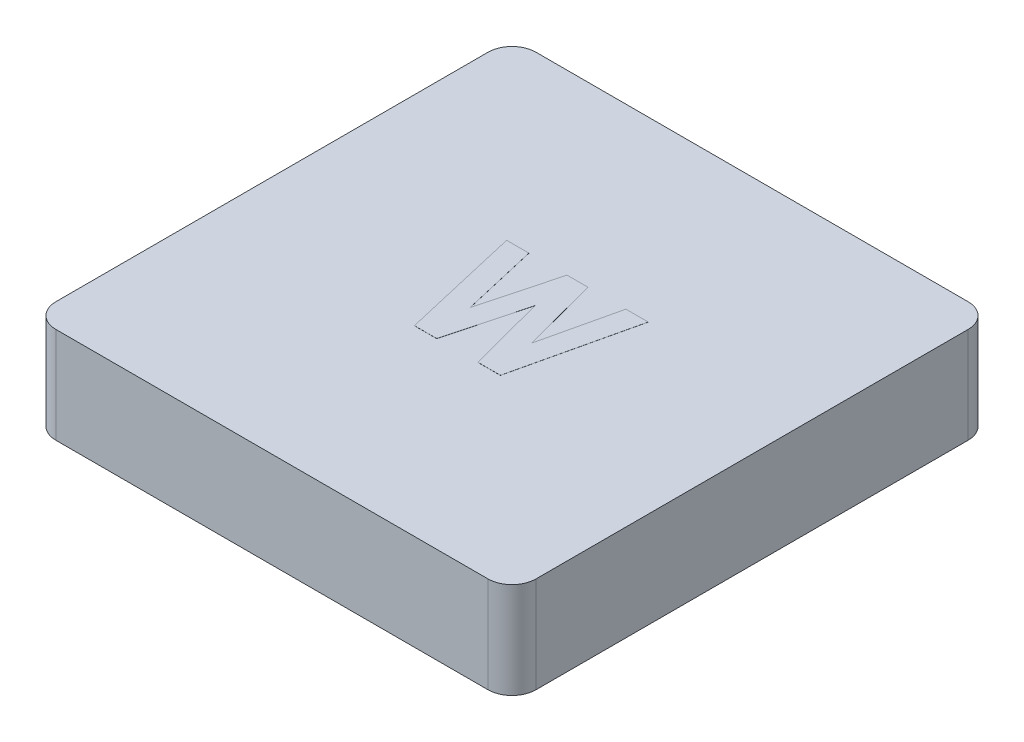
ISO-10303-21;
HEADER;
FILE_DESCRIPTION(('STEP AP214'),'2;1');
FILE_NAME('part.step','',(''),(''),'','','');
FILE_SCHEMA(('AUTOMOTIVE_DESIGN { 1 0 10303 214 1 1 1 1 }'));
ENDSEC;
DATA;
#1=APPLICATION_CONTEXT('core data for automotive mechanical design processes');
#2=APPLICATION_PROTOCOL_DEFINITION('international standard','automotive_design',2000,#1);
#3=PRODUCT_CONTEXT('',#1,'mechanical');
#4=PRODUCT('Part','Part','',(#3));
#5=PRODUCT_RELATED_PRODUCT_CATEGORY('part','',(#4));
#6=PRODUCT_DEFINITION_FORMATION('','',#4);
#7=PRODUCT_DEFINITION_CONTEXT('part definition',#1,'design');
#8=PRODUCT_DEFINITION('design','',#6,#7);
#9=PRODUCT_DEFINITION_SHAPE('','',#8);
#10=(LENGTH_UNIT() NAMED_UNIT(*) SI_UNIT(.MILLI.,.METRE.));
#11=(NAMED_UNIT(*) PLANE_ANGLE_UNIT() SI_UNIT($,.RADIAN.));
#12=(NAMED_UNIT(*) SI_UNIT($,.STERADIAN.) SOLID_ANGLE_UNIT());
#13=UNCERTAINTY_MEASURE_WITH_UNIT(LENGTH_MEASURE(1.E-05),#10,'distance_accuracy_value','');
#14=(GEOMETRIC_REPRESENTATION_CONTEXT(3) GLOBAL_UNCERTAINTY_ASSIGNED_CONTEXT((#13)) GLOBAL_UNIT_ASSIGNED_CONTEXT((#10,
#11,#12)) REPRESENTATION_CONTEXT('',''));
#15=CARTESIAN_POINT('',(0.,0.,0.));
#16=DIRECTION('',(0.,0.,1.));
#17=DIRECTION('',(1.,0.,0.));
#18=AXIS2_PLACEMENT_3D('',#15,#16,#17);
#19=CARTESIAN_POINT('',(0.,2.54,-12.7));
#20=DIRECTION('',(1.,0.,0.));
#21=DIRECTION('',(0.,0.,-1.));
#22=AXIS2_PLACEMENT_3D('',#19,#20,#21);
#23=PLANE('',#22);
#24=DIRECTION('',(0.,0.,1.));
#25=VECTOR('',#24,1.);
#26=CARTESIAN_POINT('',(0.,2.54,-12.7));
#27=LINE('',#26,#25);
#28=CARTESIAN_POINT('',(0.,2.54,-12.065));
#29=VERTEX_POINT('',#28);
#30=CARTESIAN_POINT('',(0.,2.54,-0.635));
#31=VERTEX_POINT('',#30);
#32=EDGE_CURVE('E350',#29,#31,#27,.T.);
#33=ORIENTED_EDGE('',*,*,#32,.F.);
#34=DIRECTION('',(0.,-1.,0.));
#35=VECTOR('',#34,1.);
#36=CARTESIAN_POINT('',(0.,2.54,-12.065));
#37=LINE('',#36,#35);
#38=CARTESIAN_POINT('',(0.,0.,-12.065));
#39=VERTEX_POINT('',#38);
#40=EDGE_CURVE('E375',#29,#39,#37,.T.);
#41=ORIENTED_EDGE('',*,*,#40,.T.);
#42=DIRECTION('',(0.,0.,1.));
#43=VECTOR('',#42,1.);
#44=CARTESIAN_POINT('',(0.,0.,-12.7));
#45=LINE('',#44,#43);
#46=CARTESIAN_POINT('',(0.,0.,-0.635));
#47=VERTEX_POINT('',#46);
#48=EDGE_CURVE('E330',#39,#47,#45,.T.);
#49=ORIENTED_EDGE('',*,*,#48,.T.);
#50=DIRECTION('',(0.,-1.,0.));
#51=VECTOR('',#50,1.);
#52=CARTESIAN_POINT('',(0.,2.54,-0.635));
#53=LINE('',#52,#51);
#54=EDGE_CURVE('E363',#47,#31,#53,.F.);
#55=ORIENTED_EDGE('',*,*,#54,.T.);
#56=EDGE_LOOP('',(#33,#41,#49,#55));
#57=FACE_BOUND('',#56,.T.);
#58=ADVANCED_FACE('F33',(#57),#23,.F.);
#59=CARTESIAN_POINT('',(0.,2.54,0.));
#60=DIRECTION('',(0.,0.,-1.));
#61=DIRECTION('',(-1.,0.,0.));
#62=AXIS2_PLACEMENT_3D('',#59,#60,#61);
#63=PLANE('',#62);
#64=DIRECTION('',(1.,0.,0.));
#65=VECTOR('',#64,1.);
#66=CARTESIAN_POINT('',(0.,0.,0.));
#67=LINE('',#66,#65);
#68=CARTESIAN_POINT('',(0.635,0.,0.));
#69=VERTEX_POINT('',#68);
#70=CARTESIAN_POINT('',(12.065,0.,0.));
#71=VERTEX_POINT('',#70);
#72=EDGE_CURVE('E366',#69,#71,#67,.T.);
#73=ORIENTED_EDGE('',*,*,#72,.T.);
#74=DIRECTION('',(0.,-1.,0.));
#75=VECTOR('',#74,1.);
#76=CARTESIAN_POINT('',(12.065,2.54,0.));
#77=LINE('',#76,#75);
#78=CARTESIAN_POINT('',(12.065,2.54,0.));
#79=VERTEX_POINT('',#78);
#80=EDGE_CURVE('E41',#71,#79,#77,.F.);
#81=ORIENTED_EDGE('',*,*,#80,.T.);
#82=DIRECTION('',(1.,0.,0.));
#83=VECTOR('',#82,1.);
#84=CARTESIAN_POINT('',(0.,2.54,0.));
#85=LINE('',#84,#83);
#86=CARTESIAN_POINT('',(0.635,2.54,0.));
#87=VERTEX_POINT('',#86);
#88=EDGE_CURVE('E353',#87,#79,#85,.T.);
#89=ORIENTED_EDGE('',*,*,#88,.F.);
#90=DIRECTION('',(0.,-1.,0.));
#91=VECTOR('',#90,1.);
#92=CARTESIAN_POINT('',(0.635,2.54,0.));
#93=LINE('',#92,#91);
#94=EDGE_CURVE('E404',#87,#69,#93,.T.);
#95=ORIENTED_EDGE('',*,*,#94,.T.);
#96=EDGE_LOOP('',(#73,#81,#89,#95));
#97=FACE_BOUND('',#96,.T.);
#98=ADVANCED_FACE('F409',(#97),#63,.F.);
#99=CARTESIAN_POINT('',(12.7,2.54,0.));
#100=DIRECTION('',(-1.,0.,0.));
#101=DIRECTION('',(0.,0.,1.));
#102=AXIS2_PLACEMENT_3D('',#99,#100,#101);
#103=PLANE('',#102);
#104=DIRECTION('',(0.,0.,-1.));
#105=VECTOR('',#104,1.);
#106=CARTESIAN_POINT('',(12.7,0.,0.));
#107=LINE('',#106,#105);
#108=CARTESIAN_POINT('',(12.7,0.,-0.635));
#109=VERTEX_POINT('',#108);
#110=CARTESIAN_POINT('',(12.7,0.,-12.065));
#111=VERTEX_POINT('',#110);
#112=EDGE_CURVE('E369',#109,#111,#107,.T.);
#113=ORIENTED_EDGE('',*,*,#112,.T.);
#114=DIRECTION('',(0.,-1.,0.));
#115=VECTOR('',#114,1.);
#116=CARTESIAN_POINT('',(12.7,2.54,-12.065));
#117=LINE('',#116,#115);
#118=CARTESIAN_POINT('',(12.7,2.54,-12.065));
#119=VERTEX_POINT('',#118);
#120=EDGE_CURVE('E402',#111,#119,#117,.F.);
#121=ORIENTED_EDGE('',*,*,#120,.T.);
#122=DIRECTION('',(0.,0.,-1.));
#123=VECTOR('',#122,1.);
#124=CARTESIAN_POINT('',(12.7,2.54,0.));
#125=LINE('',#124,#123);
#126=CARTESIAN_POINT('',(12.7,2.54,-0.635));
#127=VERTEX_POINT('',#126);
#128=EDGE_CURVE('E357',#127,#119,#125,.T.);
#129=ORIENTED_EDGE('',*,*,#128,.F.);
#130=DIRECTION('',(0.,-1.,0.));
#131=VECTOR('',#130,1.);
#132=CARTESIAN_POINT('',(12.7,2.54,-0.635));
#133=LINE('',#132,#131);
#134=EDGE_CURVE('E399',#127,#109,#133,.T.);
#135=ORIENTED_EDGE('',*,*,#134,.T.);
#136=EDGE_LOOP('',(#113,#121,#129,#135));
#137=FACE_BOUND('',#136,.T.);
#138=ADVANCED_FACE('F422',(#137),#103,.F.);
#139=CARTESIAN_POINT('',(12.7,2.54,-12.7));
#140=DIRECTION('',(0.,0.,1.));
#141=DIRECTION('',(1.,0.,0.));
#142=AXIS2_PLACEMENT_3D('',#139,#140,#141);
#143=PLANE('',#142);
#144=DIRECTION('',(-1.,0.,0.));
#145=VECTOR('',#144,1.);
#146=CARTESIAN_POINT('',(12.7,0.,-12.7));
#147=LINE('',#146,#145);
#148=CARTESIAN_POINT('',(12.065,0.,-12.7));
#149=VERTEX_POINT('',#148);
#150=CARTESIAN_POINT('',(0.634999999999995,0.,-12.7));
#151=VERTEX_POINT('',#150);
#152=EDGE_CURVE('E354',#149,#151,#147,.T.);
#153=ORIENTED_EDGE('',*,*,#152,.T.);
#154=DIRECTION('',(0.,-1.,0.));
#155=VECTOR('',#154,1.);
#156=CARTESIAN_POINT('',(0.634999999999995,2.54,-12.7));
#157=LINE('',#156,#155);
#158=CARTESIAN_POINT('',(0.634999999999995,2.54,-12.7));
#159=VERTEX_POINT('',#158);
#160=EDGE_CURVE('E389',#151,#159,#157,.F.);
#161=ORIENTED_EDGE('',*,*,#160,.T.);
#162=DIRECTION('',(-1.,0.,0.));
#163=VECTOR('',#162,1.);
#164=CARTESIAN_POINT('',(12.7,2.54,-12.7));
#165=LINE('',#164,#163);
#166=CARTESIAN_POINT('',(12.065,2.54,-12.7));
#167=VERTEX_POINT('',#166);
#168=EDGE_CURVE('E360',#167,#159,#165,.T.);
#169=ORIENTED_EDGE('',*,*,#168,.F.);
#170=DIRECTION('',(0.,-1.,0.));
#171=VECTOR('',#170,1.);
#172=CARTESIAN_POINT('',(12.065,2.54,-12.7));
#173=LINE('',#172,#171);
#174=EDGE_CURVE('E386',#167,#149,#173,.T.);
#175=ORIENTED_EDGE('',*,*,#174,.T.);
#176=EDGE_LOOP('',(#153,#161,#169,#175));
#177=FACE_BOUND('',#176,.T.);
#178=ADVANCED_FACE('F434',(#177),#143,.F.);
#179=CARTESIAN_POINT('',(0.,2.54,0.));
#180=DIRECTION('',(0.,1.,0.));
#181=DIRECTION('',(0.,0.,1.));
#182=AXIS2_PLACEMENT_3D('',#179,#180,#181);
#183=PLANE('',#182);
#184=DIRECTION('',(-0.225785808146435,0.,-0.974176969980127));
#185=VECTOR('',#184,1.);
#186=CARTESIAN_POINT('',(5.29273008814102,2.54,-4.826));
#187=LINE('',#186,#185);
#188=CARTESIAN_POINT('',(5.29273008814102,2.54,-4.826));
#189=VERTEX_POINT('',#188);
#190=CARTESIAN_POINT('',(4.55685769230769,2.54,-8.001));
#191=VERTEX_POINT('',#190);
#192=EDGE_CURVE('E257',#189,#191,#187,.T.);
#193=ORIENTED_EDGE('',*,*,#192,.T.);
#194=DIRECTION('',(1.,0.,0.));
#195=VECTOR('',#194,1.);
#196=CARTESIAN_POINT('',(4.55685769230769,2.54,-8.001));
#197=LINE('',#196,#195);
#198=CARTESIAN_POINT('',(5.14517399839743,2.54,-8.001));
#199=VERTEX_POINT('',#198);
#200=EDGE_CURVE('E205',#191,#199,#197,.T.);
#201=ORIENTED_EDGE('',*,*,#200,.T.);
#202=DIRECTION('',(0.225886278135308,0.,0.974153678507749));
#203=VECTOR('',#202,1.);
#204=CARTESIAN_POINT('',(5.14517399839743,2.54,-8.001));
#205=LINE('',#204,#203);
#206=CARTESIAN_POINT('',(5.61519102564102,2.54,-5.97401181891026));
#207=VERTEX_POINT('',#206);
#208=EDGE_CURVE('E260',#199,#207,#205,.T.);
#209=ORIENTED_EDGE('',*,*,#208,.T.);
#210=DIRECTION('',(0.256850962616634,0.,-0.966451024627171));
#211=VECTOR('',#210,1.);
#212=CARTESIAN_POINT('',(5.61519102564102,2.54,-5.97401181891026));
#213=LINE('',#212,#211);
#214=CARTESIAN_POINT('',(6.15389795673076,2.54,-8.001));
#215=VERTEX_POINT('',#214);
#216=EDGE_CURVE('E262',#207,#215,#213,.T.);
#217=ORIENTED_EDGE('',*,*,#216,.T.);
#218=DIRECTION('',(1.,0.,0.));
#219=VECTOR('',#218,1.);
#220=CARTESIAN_POINT('',(6.15389795673076,2.54,-8.001));
#221=LINE('',#220,#219);
#222=CARTESIAN_POINT('',(6.70786931089743,2.54,-8.001));
#223=VERTEX_POINT('',#222);
#224=EDGE_CURVE('E264',#215,#223,#221,.T.);
#225=ORIENTED_EDGE('',*,*,#224,.T.);
#226=DIRECTION('',(0.255433926933029,0.,0.966826514412783));
#227=VECTOR('',#226,1.);
#228=CARTESIAN_POINT('',(6.70786931089743,2.54,-8.001));
#229=LINE('',#228,#227);
#230=CARTESIAN_POINT('',(7.24339615384615,2.54,-5.97401181891026));
#231=VERTEX_POINT('',#230);
#232=EDGE_CURVE('E266',#223,#231,#229,.T.);
#233=ORIENTED_EDGE('',*,*,#232,.T.);
#234=DIRECTION('',(0.225306021326748,0.,-0.974288046090021));
#235=VECTOR('',#234,1.);
#236=CARTESIAN_POINT('',(7.24339615384615,2.54,-5.97401181891026));
#237=LINE('',#236,#235);
#238=CARTESIAN_POINT('',(7.71214114583333,2.54,-8.001));
#239=VERTEX_POINT('',#238);
#240=EDGE_CURVE('E268',#231,#239,#237,.T.);
#241=ORIENTED_EDGE('',*,*,#240,.T.);
#242=DIRECTION('',(1.,0.,0.));
#243=VECTOR('',#242,1.);
#244=CARTESIAN_POINT('',(7.71214114583333,2.54,-8.001));
#245=LINE('',#244,#243);
#246=CARTESIAN_POINT('',(8.30172948717948,2.54,-8.001));
#247=VERTEX_POINT('',#246);
#248=EDGE_CURVE('E270',#239,#247,#245,.T.);
#249=ORIENTED_EDGE('',*,*,#248,.T.);
#250=DIRECTION('',(-0.225415360898369,0.,0.974262754636067));
#251=VECTOR('',#250,1.);
#252=CARTESIAN_POINT('',(8.30172948717948,2.54,-8.001));
#253=LINE('',#252,#251);
#254=CARTESIAN_POINT('',(7.56712912660256,2.54,-4.826));
#255=VERTEX_POINT('',#254);
#256=EDGE_CURVE('E272',#247,#255,#253,.T.);
#257=ORIENTED_EDGE('',*,*,#256,.T.);
#258=DIRECTION('',(-1.,0.,0.));
#259=VECTOR('',#258,1.);
#260=CARTESIAN_POINT('',(7.56712912660256,2.54,-4.826));
#261=LINE('',#260,#259);
#262=CARTESIAN_POINT('',(6.97181662660256,2.54,-4.826));
#263=VERTEX_POINT('',#262);
#264=EDGE_CURVE('E274',#255,#263,#261,.T.);
#265=ORIENTED_EDGE('',*,*,#264,.T.);
#266=DIRECTION('',(-0.255554924607687,0.,-0.966794538932011));
#267=VECTOR('',#266,1.);
#268=CARTESIAN_POINT('',(6.97181662660256,2.54,-4.826));
#269=LINE('',#268,#267);
#270=CARTESIAN_POINT('',(6.42929358974358,2.54,-6.87842888621795));
#271=VERTEX_POINT('',#270);
#272=EDGE_CURVE('E276',#263,#271,#269,.T.);
#273=ORIENTED_EDGE('',*,*,#272,.T.);
#274=DIRECTION('',(-0.256954266459514,0.,0.96642356394505));
#275=VECTOR('',#274,1.);
#276=CARTESIAN_POINT('',(6.42929358974358,2.54,-6.87842888621795));
#277=LINE('',#276,#275);
#278=CARTESIAN_POINT('',(5.88359046474358,2.54,-4.826));
#279=VERTEX_POINT('',#278);
#280=EDGE_CURVE('E53',#271,#279,#277,.T.);
#281=ORIENTED_EDGE('',*,*,#280,.T.);
#282=DIRECTION('',(-1.,0.,0.));
#283=VECTOR('',#282,1.);
#284=CARTESIAN_POINT('',(5.88359046474358,2.54,-4.826));
#285=LINE('',#284,#283);
#286=EDGE_CURVE('E48',#279,#189,#285,.T.);
#287=ORIENTED_EDGE('',*,*,#286,.T.);
#288=EDGE_LOOP('',(#193,#201,#209,#217,#225,#233,#241,#249,#257,#265,#273,#281,#287));
#289=FACE_BOUND('',#288,.T.);
#290=ORIENTED_EDGE('',*,*,#168,.T.);
#291=CARTESIAN_POINT('',(0.634999999999995,2.54,-12.065));
#292=DIRECTION('',(0.,1.,0.));
#293=DIRECTION('',(0.,0.,1.));
#294=AXIS2_PLACEMENT_3D('',#291,#292,#293);
#295=CIRCLE('',#294,0.635);
#296=EDGE_CURVE('E397',#159,#29,#295,.T.);
#297=ORIENTED_EDGE('',*,*,#296,.T.);
#298=ORIENTED_EDGE('',*,*,#32,.T.);
#299=CARTESIAN_POINT('',(0.635,2.54,-0.635));
#300=DIRECTION('',(0.,1.,0.));
#301=DIRECTION('',(0.,0.,1.));
#302=AXIS2_PLACEMENT_3D('',#299,#300,#301);
#303=CIRCLE('',#302,0.635);
#304=EDGE_CURVE('E391',#31,#87,#303,.T.);
#305=ORIENTED_EDGE('',*,*,#304,.T.);
#306=ORIENTED_EDGE('',*,*,#88,.T.);
#307=CARTESIAN_POINT('',(12.065,2.54,-0.635));
#308=DIRECTION('',(0.,1.,0.));
#309=DIRECTION('',(0.,0.,1.));
#310=AXIS2_PLACEMENT_3D('',#307,#308,#309);
#311=CIRCLE('',#310,0.635);
#312=EDGE_CURVE('E393',#79,#127,#311,.T.);
#313=ORIENTED_EDGE('',*,*,#312,.T.);
#314=ORIENTED_EDGE('',*,*,#128,.T.);
#315=CARTESIAN_POINT('',(12.065,2.54,-12.065));
#316=DIRECTION('',(0.,1.,0.));
#317=DIRECTION('',(0.,0.,1.));
#318=AXIS2_PLACEMENT_3D('',#315,#316,#317);
#319=CIRCLE('',#318,0.635);
#320=EDGE_CURVE('E395',#119,#167,#319,.T.);
#321=ORIENTED_EDGE('',*,*,#320,.T.);
#322=EDGE_LOOP('',(#290,#297,#298,#305,#306,#313,#314,#321));
#323=FACE_BOUND('',#322,.T.);
#324=ADVANCED_FACE('F415',(#289,#323),#183,.T.);
#325=CARTESIAN_POINT('',(0.,0.,0.));
#326=DIRECTION('',(0.,1.,0.));
#327=DIRECTION('',(0.,0.,1.));
#328=AXIS2_PLACEMENT_3D('',#325,#326,#327);
#329=PLANE('',#328);
#330=DIRECTION('',(-1.,0.,0.));
#331=VECTOR('',#330,1.);
#332=CARTESIAN_POINT('',(12.7,0.,-12.065));
#333=LINE('',#332,#331);
#334=CARTESIAN_POINT('',(12.065,0.,-12.065));
#335=VERTEX_POINT('',#334);
#336=CARTESIAN_POINT('',(0.634999999999995,0.,-12.065));
#337=VERTEX_POINT('',#336);
#338=EDGE_CURVE('E318',#335,#337,#333,.T.);
#339=ORIENTED_EDGE('',*,*,#338,.T.);
#340=DIRECTION('',(0.,0.,1.));
#341=VECTOR('',#340,1.);
#342=CARTESIAN_POINT('',(0.634999999999995,0.,-12.7));
#343=LINE('',#342,#341);
#344=CARTESIAN_POINT('',(0.635,0.,-0.635));
#345=VERTEX_POINT('',#344);
#346=EDGE_CURVE('E313',#337,#345,#343,.T.);
#347=ORIENTED_EDGE('',*,*,#346,.T.);
#348=DIRECTION('',(1.,0.,0.));
#349=VECTOR('',#348,1.);
#350=CARTESIAN_POINT('',(0.,0.,-0.635));
#351=LINE('',#350,#349);
#352=CARTESIAN_POINT('',(12.065,0.,-0.635));
#353=VERTEX_POINT('',#352);
#354=EDGE_CURVE('E342',#345,#353,#351,.T.);
#355=ORIENTED_EDGE('',*,*,#354,.T.);
#356=DIRECTION('',(0.,0.,-1.));
#357=VECTOR('',#356,1.);
#358=CARTESIAN_POINT('',(12.065,0.,0.));
#359=LINE('',#358,#357);
#360=EDGE_CURVE('E345',#353,#335,#359,.T.);
#361=ORIENTED_EDGE('',*,*,#360,.T.);
#362=EDGE_LOOP('',(#339,#347,#355,#361));
#363=FACE_BOUND('',#362,.T.);
#364=ORIENTED_EDGE('',*,*,#48,.F.);
#365=CARTESIAN_POINT('',(0.634999999999995,0.,-12.065));
#366=DIRECTION('',(0.,1.,0.));
#367=DIRECTION('',(0.,0.,1.));
#368=AXIS2_PLACEMENT_3D('',#365,#366,#367);
#369=CIRCLE('',#368,0.635);
#370=EDGE_CURVE('E384',#39,#151,#369,.F.);
#371=ORIENTED_EDGE('',*,*,#370,.T.);
#372=ORIENTED_EDGE('',*,*,#152,.F.);
#373=CARTESIAN_POINT('',(12.065,0.,-12.065));
#374=DIRECTION('',(0.,1.,0.));
#375=DIRECTION('',(0.,0.,1.));
#376=AXIS2_PLACEMENT_3D('',#373,#374,#375);
#377=CIRCLE('',#376,0.635);
#378=EDGE_CURVE('E382',#149,#111,#377,.F.);
#379=ORIENTED_EDGE('',*,*,#378,.T.);
#380=ORIENTED_EDGE('',*,*,#112,.F.);
#381=CARTESIAN_POINT('',(12.065,0.,-0.635));
#382=DIRECTION('',(0.,1.,0.));
#383=DIRECTION('',(0.,0.,1.));
#384=AXIS2_PLACEMENT_3D('',#381,#382,#383);
#385=CIRCLE('',#384,0.635);
#386=EDGE_CURVE('E380',#109,#71,#385,.F.);
#387=ORIENTED_EDGE('',*,*,#386,.T.);
#388=ORIENTED_EDGE('',*,*,#72,.F.);
#389=CARTESIAN_POINT('',(0.635,0.,-0.635));
#390=DIRECTION('',(0.,1.,0.));
#391=DIRECTION('',(0.,0.,1.));
#392=AXIS2_PLACEMENT_3D('',#389,#390,#391);
#393=CIRCLE('',#392,0.635);
#394=EDGE_CURVE('E378',#69,#47,#393,.F.);
#395=ORIENTED_EDGE('',*,*,#394,.T.);
#396=EDGE_LOOP('',(#364,#371,#372,#379,#380,#387,#388,#395));
#397=FACE_BOUND('',#396,.T.);
#398=ADVANCED_FACE('F426',(#363,#397),#329,.F.);
#399=CARTESIAN_POINT('',(0.634999999999995,2.54,-12.065));
#400=DIRECTION('',(0.,-1.,0.));
#401=DIRECTION('',(0.,0.,-1.));
#402=AXIS2_PLACEMENT_3D('',#399,#400,#401);
#403=CYLINDRICAL_SURFACE('',#402,0.635);
#404=ORIENTED_EDGE('',*,*,#296,.F.);
#405=ORIENTED_EDGE('',*,*,#160,.F.);
#406=ORIENTED_EDGE('',*,*,#370,.F.);
#407=ORIENTED_EDGE('',*,*,#40,.F.);
#408=EDGE_LOOP('',(#404,#405,#406,#407));
#409=FACE_BOUND('',#408,.T.);
#410=ADVANCED_FACE('F440',(#409),#403,.T.);
#411=CARTESIAN_POINT('',(12.065,2.54,-12.065));
#412=DIRECTION('',(0.,-1.,0.));
#413=DIRECTION('',(0.,0.,-1.));
#414=AXIS2_PLACEMENT_3D('',#411,#412,#413);
#415=CYLINDRICAL_SURFACE('',#414,0.635);
#416=ORIENTED_EDGE('',*,*,#320,.F.);
#417=ORIENTED_EDGE('',*,*,#120,.F.);
#418=ORIENTED_EDGE('',*,*,#378,.F.);
#419=ORIENTED_EDGE('',*,*,#174,.F.);
#420=EDGE_LOOP('',(#416,#417,#418,#419));
#421=FACE_BOUND('',#420,.T.);
#422=ADVANCED_FACE('F431',(#421),#415,.T.);
#423=CARTESIAN_POINT('',(12.065,2.54,-0.635));
#424=DIRECTION('',(0.,-1.,0.));
#425=DIRECTION('',(0.,0.,-1.));
#426=AXIS2_PLACEMENT_3D('',#423,#424,#425);
#427=CYLINDRICAL_SURFACE('',#426,0.635);
#428=ORIENTED_EDGE('',*,*,#312,.F.);
#429=ORIENTED_EDGE('',*,*,#80,.F.);
#430=ORIENTED_EDGE('',*,*,#386,.F.);
#431=ORIENTED_EDGE('',*,*,#134,.F.);
#432=EDGE_LOOP('',(#428,#429,#430,#431));
#433=FACE_BOUND('',#432,.T.);
#434=ADVANCED_FACE('F419',(#433),#427,.T.);
#435=CARTESIAN_POINT('',(0.635,2.54,-0.635));
#436=DIRECTION('',(0.,-1.,0.));
#437=DIRECTION('',(0.,0.,-1.));
#438=AXIS2_PLACEMENT_3D('',#435,#436,#437);
#439=CYLINDRICAL_SURFACE('',#438,0.635);
#440=ORIENTED_EDGE('',*,*,#304,.F.);
#441=ORIENTED_EDGE('',*,*,#54,.F.);
#442=ORIENTED_EDGE('',*,*,#394,.F.);
#443=ORIENTED_EDGE('',*,*,#94,.F.);
#444=EDGE_LOOP('',(#440,#441,#442,#443));
#445=FACE_BOUND('',#444,.T.);
#446=ADVANCED_FACE('F35',(#445),#439,.T.);
#447=CARTESIAN_POINT('',(0.634999999999995,2.54,-12.7));
#448=DIRECTION('',(1.,0.,0.));
#449=DIRECTION('',(0.,0.,-1.));
#450=AXIS2_PLACEMENT_3D('',#447,#448,#449);
#451=PLANE('',#450);
#452=DIRECTION('',(0.,0.,1.));
#453=VECTOR('',#452,1.);
#454=CARTESIAN_POINT('',(0.634999999999995,1.905,-12.7));
#455=LINE('',#454,#453);
#456=CARTESIAN_POINT('',(0.634999999999995,1.905,-12.065));
#457=VERTEX_POINT('',#456);
#458=CARTESIAN_POINT('',(0.635,1.905,-0.635));
#459=VERTEX_POINT('',#458);
#460=EDGE_CURVE('E314',#457,#459,#455,.T.);
#461=ORIENTED_EDGE('',*,*,#460,.T.);
#462=DIRECTION('',(0.,1.,0.));
#463=VECTOR('',#462,1.);
#464=CARTESIAN_POINT('',(0.635,2.54,-0.635));
#465=LINE('',#464,#463);
#466=EDGE_CURVE('E323',#345,#459,#465,.T.);
#467=ORIENTED_EDGE('',*,*,#466,.F.);
#468=ORIENTED_EDGE('',*,*,#346,.F.);
#469=DIRECTION('',(0.,1.,0.));
#470=VECTOR('',#469,1.);
#471=CARTESIAN_POINT('',(0.634999999999995,2.54,-12.065));
#472=LINE('',#471,#470);
#473=EDGE_CURVE('E319',#337,#457,#472,.T.);
#474=ORIENTED_EDGE('',*,*,#473,.T.);
#475=EDGE_LOOP('',(#461,#467,#468,#474));
#476=FACE_BOUND('',#475,.T.);
#477=ADVANCED_FACE('F445',(#476),#451,.T.);
#478=CARTESIAN_POINT('',(0.,2.54,-0.635));
#479=DIRECTION('',(0.,0.,-1.));
#480=DIRECTION('',(-1.,0.,0.));
#481=AXIS2_PLACEMENT_3D('',#478,#479,#480);
#482=PLANE('',#481);
#483=ORIENTED_EDGE('',*,*,#354,.F.);
#484=ORIENTED_EDGE('',*,*,#466,.T.);
#485=DIRECTION('',(1.,0.,0.));
#486=VECTOR('',#485,1.);
#487=CARTESIAN_POINT('',(0.,1.905,-0.635));
#488=LINE('',#487,#486);
#489=CARTESIAN_POINT('',(12.065,1.905,-0.635));
#490=VERTEX_POINT('',#489);
#491=EDGE_CURVE('E317',#459,#490,#488,.T.);
#492=ORIENTED_EDGE('',*,*,#491,.T.);
#493=DIRECTION('',(0.,1.,0.));
#494=VECTOR('',#493,1.);
#495=CARTESIAN_POINT('',(12.065,2.54,-0.635));
#496=LINE('',#495,#494);
#497=EDGE_CURVE('E327',#353,#490,#496,.T.);
#498=ORIENTED_EDGE('',*,*,#497,.F.);
#499=EDGE_LOOP('',(#483,#484,#492,#498));
#500=FACE_BOUND('',#499,.T.);
#501=ADVANCED_FACE('F450',(#500),#482,.T.);
#502=CARTESIAN_POINT('',(12.065,2.54,0.));
#503=DIRECTION('',(-1.,0.,0.));
#504=DIRECTION('',(0.,0.,1.));
#505=AXIS2_PLACEMENT_3D('',#502,#503,#504);
#506=PLANE('',#505);
#507=ORIENTED_EDGE('',*,*,#360,.F.);
#508=ORIENTED_EDGE('',*,*,#497,.T.);
#509=DIRECTION('',(0.,0.,-1.));
#510=VECTOR('',#509,1.);
#511=CARTESIAN_POINT('',(12.065,1.905,0.));
#512=LINE('',#511,#510);
#513=CARTESIAN_POINT('',(12.065,1.905,-12.065));
#514=VERTEX_POINT('',#513);
#515=EDGE_CURVE('E333',#490,#514,#512,.T.);
#516=ORIENTED_EDGE('',*,*,#515,.T.);
#517=DIRECTION('',(0.,1.,0.));
#518=VECTOR('',#517,1.);
#519=CARTESIAN_POINT('',(12.065,2.54,-12.065));
#520=LINE('',#519,#518);
#521=EDGE_CURVE('E322',#335,#514,#520,.T.);
#522=ORIENTED_EDGE('',*,*,#521,.F.);
#523=EDGE_LOOP('',(#507,#508,#516,#522));
#524=FACE_BOUND('',#523,.T.);
#525=ADVANCED_FACE('F503',(#524),#506,.T.);
#526=CARTESIAN_POINT('',(12.7,2.54,-12.065));
#527=DIRECTION('',(0.,0.,1.));
#528=DIRECTION('',(1.,0.,0.));
#529=AXIS2_PLACEMENT_3D('',#526,#527,#528);
#530=PLANE('',#529);
#531=ORIENTED_EDGE('',*,*,#338,.F.);
#532=ORIENTED_EDGE('',*,*,#521,.T.);
#533=DIRECTION('',(-1.,0.,0.));
#534=VECTOR('',#533,1.);
#535=CARTESIAN_POINT('',(12.7,1.905,-12.065));
#536=LINE('',#535,#534);
#537=EDGE_CURVE('E326',#514,#457,#536,.T.);
#538=ORIENTED_EDGE('',*,*,#537,.T.);
#539=ORIENTED_EDGE('',*,*,#473,.F.);
#540=EDGE_LOOP('',(#531,#532,#538,#539));
#541=FACE_BOUND('',#540,.T.);
#542=ADVANCED_FACE('F513',(#541),#530,.T.);
#543=CARTESIAN_POINT('',(0.,1.905,0.));
#544=DIRECTION('',(0.,1.,0.));
#545=DIRECTION('',(0.,0.,1.));
#546=AXIS2_PLACEMENT_3D('',#543,#544,#545);
#547=PLANE('',#546);
#548=CARTESIAN_POINT('',(6.34999999999999,1.905,-6.35));
#549=DIRECTION('',(0.,1.,0.));
#550=DIRECTION('',(0.,0.,1.));
#551=AXIS2_PLACEMENT_3D('',#548,#549,#550);
#552=CIRCLE('',#551,2.54);
#553=CARTESIAN_POINT('',(6.34999999999999,1.905,-3.81));
#554=VERTEX_POINT('',#553);
#555=EDGE_CURVE('E11',#554,#554,#552,.F.);
#556=ORIENTED_EDGE('',*,*,#555,.F.);
#557=EDGE_LOOP('',(#556));
#558=FACE_BOUND('',#557,.T.);
#559=ORIENTED_EDGE('',*,*,#537,.F.);
#560=ORIENTED_EDGE('',*,*,#515,.F.);
#561=ORIENTED_EDGE('',*,*,#491,.F.);
#562=ORIENTED_EDGE('',*,*,#460,.F.);
#563=EDGE_LOOP('',(#559,#560,#561,#562));
#564=FACE_BOUND('',#563,.T.);
#565=ADVANCED_FACE('F523',(#558,#564),#547,.F.);
#566=CARTESIAN_POINT('',(6.34999999999999,-7.18420489685532,-6.35));
#567=DIRECTION('',(0.,1.,0.));
#568=DIRECTION('',(0.,0.,1.));
#569=AXIS2_PLACEMENT_3D('',#566,#567,#568);
#570=CYLINDRICAL_SURFACE('',#569,2.54);
#571=CARTESIAN_POINT('',(6.34999999999999,0.,-6.35));
#572=DIRECTION('',(0.,1.,0.));
#573=DIRECTION('',(0.,0.,1.));
#574=AXIS2_PLACEMENT_3D('',#571,#572,#573);
#575=CIRCLE('',#574,2.54);
#576=CARTESIAN_POINT('',(6.34999999999999,0.,-3.81));
#577=VERTEX_POINT('',#576);
#578=EDGE_CURVE('E280',#577,#577,#575,.T.);
#579=CARTESIAN_POINT('',(6.34999999999999,0.,-3.81));
#580=CARTESIAN_POINT('',(6.34999999999999,0.0198437499999991,-3.81));
#581=CARTESIAN_POINT('',(6.34999999999999,0.0396874999999989,-3.81));
#582=CARTESIAN_POINT('',(6.34999999999999,0.079374999999999,-3.81));
#583=CARTESIAN_POINT('',(6.34999999999999,0.0992187499999992,-3.81));
#584=CARTESIAN_POINT('',(6.34999999999999,0.138906249999999,-3.81));
#585=CARTESIAN_POINT('',(6.34999999999999,0.158749999999999,-3.81));
#586=CARTESIAN_POINT('',(6.34999999999999,0.198437499999999,-3.81));
#587=CARTESIAN_POINT('',(6.34999999999999,0.218281249999999,-3.81));
#588=CARTESIAN_POINT('',(6.34999999999999,0.25796875,-3.81));
#589=CARTESIAN_POINT('',(6.34999999999999,0.277812499999999,-3.81));
#590=CARTESIAN_POINT('',(6.34999999999999,0.317499999999999,-3.81));
#591=CARTESIAN_POINT('',(6.34999999999999,0.337343749999999,-3.81));
#592=CARTESIAN_POINT('',(6.34999999999999,0.377031249999999,-3.81));
#593=CARTESIAN_POINT('',(6.34999999999999,0.396874999999999,-3.81));
#594=CARTESIAN_POINT('',(6.34999999999999,0.436562499999999,-3.81));
#595=CARTESIAN_POINT('',(6.34999999999999,0.456406249999999,-3.81));
#596=CARTESIAN_POINT('',(6.34999999999999,0.496093749999999,-3.81));
#597=CARTESIAN_POINT('',(6.34999999999999,0.515937499999999,-3.81));
#598=CARTESIAN_POINT('',(6.34999999999999,0.555624999999999,-3.81));
#599=CARTESIAN_POINT('',(6.34999999999999,0.575468749999999,-3.81));
#600=CARTESIAN_POINT('',(6.34999999999999,0.615156249999999,-3.81));
#601=CARTESIAN_POINT('',(6.34999999999999,0.634999999999999,-3.81));
#602=CARTESIAN_POINT('',(6.34999999999999,0.674687499999998,-3.81));
#603=CARTESIAN_POINT('',(6.34999999999999,0.694531249999998,-3.81));
#604=CARTESIAN_POINT('',(6.34999999999999,0.734218749999998,-3.81));
#605=CARTESIAN_POINT('',(6.34999999999999,0.754062499999998,-3.81));
#606=CARTESIAN_POINT('',(6.34999999999999,0.793749999999998,-3.81));
#607=CARTESIAN_POINT('',(6.34999999999999,0.813593749999999,-3.81));
#608=CARTESIAN_POINT('',(6.34999999999999,0.853281249999999,-3.81));
#609=CARTESIAN_POINT('',(6.34999999999999,0.873124999999999,-3.81));
#610=CARTESIAN_POINT('',(6.34999999999999,0.912812499999999,-3.81));
#611=CARTESIAN_POINT('',(6.34999999999999,0.932656249999999,-3.81));
#612=CARTESIAN_POINT('',(6.34999999999999,0.972343749999998,-3.81));
#613=CARTESIAN_POINT('',(6.34999999999999,0.992187499999998,-3.81));
#614=CARTESIAN_POINT('',(6.34999999999999,1.031875,-3.81));
#615=CARTESIAN_POINT('',(6.34999999999999,1.05171875,-3.81));
#616=CARTESIAN_POINT('',(6.34999999999999,1.09140625,-3.81));
#617=CARTESIAN_POINT('',(6.34999999999999,1.11125,-3.81));
#618=CARTESIAN_POINT('',(6.34999999999999,1.1509375,-3.81));
#619=CARTESIAN_POINT('',(6.34999999999999,1.17078125,-3.81));
#620=CARTESIAN_POINT('',(6.34999999999999,1.21046875,-3.81));
#621=CARTESIAN_POINT('',(6.34999999999999,1.2303125,-3.81));
#622=CARTESIAN_POINT('',(6.34999999999999,1.27,-3.81));
#623=CARTESIAN_POINT('',(6.34999999999999,1.28984375,-3.81));
#624=CARTESIAN_POINT('',(6.34999999999999,1.32953125,-3.81));
#625=CARTESIAN_POINT('',(6.34999999999999,1.349375,-3.81));
#626=CARTESIAN_POINT('',(6.34999999999999,1.3890625,-3.81));
#627=CARTESIAN_POINT('',(6.34999999999999,1.40890625,-3.81));
#628=CARTESIAN_POINT('',(6.34999999999999,1.44859375,-3.81));
#629=CARTESIAN_POINT('',(6.34999999999999,1.4684375,-3.81));
#630=CARTESIAN_POINT('',(6.34999999999999,1.508125,-3.81));
#631=CARTESIAN_POINT('',(6.34999999999999,1.52796875,-3.81));
#632=CARTESIAN_POINT('',(6.34999999999999,1.56765625,-3.81));
#633=CARTESIAN_POINT('',(6.34999999999999,1.5875,-3.81));
#634=CARTESIAN_POINT('',(6.34999999999999,1.6271875,-3.81));
#635=CARTESIAN_POINT('',(6.34999999999999,1.64703125,-3.81));
#636=CARTESIAN_POINT('',(6.34999999999999,1.68671875,-3.81));
#637=CARTESIAN_POINT('',(6.34999999999999,1.7065625,-3.81));
#638=CARTESIAN_POINT('',(6.34999999999999,1.74625,-3.81));
#639=CARTESIAN_POINT('',(6.34999999999999,1.76609375,-3.81));
#640=CARTESIAN_POINT('',(6.34999999999999,1.80578125,-3.81));
#641=CARTESIAN_POINT('',(6.34999999999999,1.825625,-3.81));
#642=CARTESIAN_POINT('',(6.34999999999999,1.8653125,-3.81));
#643=CARTESIAN_POINT('',(6.34999999999999,1.88515625,-3.81));
#644=CARTESIAN_POINT('',(6.34999999999999,1.905,-3.81));
#645=B_SPLINE_CURVE_WITH_KNOTS('',3,(#579,#580,#581,#582,#583,#584,#585,#586,#587,#588,#589,
#590,#591,#592,#593,#594,#595,#596,#597,#598,#599,#600,#601,#602,#603,#604,#605,#606,#607,#608,
#609,#610,#611,#612,#613,#614,#615,#616,#617,#618,#619,#620,#621,#622,#623,#624,#625,#626,#627,
#628,#629,#630,#631,#632,#633,#634,#635,#636,#637,#638,#639,#640,#641,#642,#643,#644),
.UNSPECIFIED.,.F.,.F.,(4,2,2,2,2,2,2,2,2,2,2,2,2,2,2,2,2,2,2,2,2,2,2,2,2,2,2,2,2,2,2,2,4),(0.,
0.0595312499999997,0.1190625,0.17859375,0.238125,0.29765625,0.3571875,0.41671875,0.47625,
0.53578125,0.5953125,0.654843749999999,0.714374999999999,0.773906249999999,0.8334375,0.89296875,
0.952499999999999,1.01203125,1.0715625,1.13109375,1.190625,1.25015625,1.3096875,1.36921875,
1.42875,1.48828125,1.5478125,1.60734375,1.666875,1.72640625,1.7859375,1.84546875,1.905),.UNSPECIFIED.);
#646=EDGE_CURVE('BSEAM533',#577,#554,#645,.T.);
#647=ORIENTED_EDGE('',*,*,#578,.T.);
#648=ORIENTED_EDGE('',*,*,#555,.T.);
#649=ORIENTED_EDGE('',*,*,#646,.T.);
#650=ORIENTED_EDGE('',*,*,#646,.F.);
#651=EDGE_LOOP('',(#647,#649,#648,#650));
#652=FACE_BOUND('',#651,.T.);
#653=ADVANCED_FACE('F533',(#652),#570,.T.);
#654=CARTESIAN_POINT('',(0.,0.,0.));
#655=DIRECTION('',(0.,1.,0.));
#656=DIRECTION('',(0.,0.,1.));
#657=AXIS2_PLACEMENT_3D('',#654,#655,#656);
#658=PLANE('',#657);
#659=ORIENTED_EDGE('',*,*,#578,.F.);
#660=EDGE_LOOP('',(#659));
#661=FACE_BOUND('',#660,.T.);
#662=ADVANCED_FACE('F543',(#661),#658,.F.);
#663=CARTESIAN_POINT('',(5.29273008814102,2.54254,-4.826));
#664=DIRECTION('',(-0.974176969980127,0.,0.225785808146435));
#665=DIRECTION('',(0.225785808146435,0.,0.974176969980127));
#666=AXIS2_PLACEMENT_3D('',#663,#664,#665);
#667=PLANE('',#666);
#668=ORIENTED_EDGE('',*,*,#192,.F.);
#669=DIRECTION('',(0.,-1.,0.));
#670=VECTOR('',#669,1.);
#671=CARTESIAN_POINT('',(5.29273008814102,2.54254,-4.826));
#672=LINE('',#671,#670);
#673=CARTESIAN_POINT('',(5.29273008814102,2.54254,-4.826));
#674=VERTEX_POINT('',#673);
#675=EDGE_CURVE('E224',#674,#189,#672,.T.);
#676=ORIENTED_EDGE('',*,*,#675,.F.);
#677=DIRECTION('',(-0.225785808146435,0.,-0.974176969980127));
#678=VECTOR('',#677,1.);
#679=CARTESIAN_POINT('',(5.29273008814102,2.54254,-4.826));
#680=LINE('',#679,#678);
#681=CARTESIAN_POINT('',(4.55685769230769,2.54254,-8.001));
#682=VERTEX_POINT('',#681);
#683=EDGE_CURVE('E217',#674,#682,#680,.T.);
#684=ORIENTED_EDGE('',*,*,#683,.T.);
#685=DIRECTION('',(0.,-1.,0.));
#686=VECTOR('',#685,1.);
#687=CARTESIAN_POINT('',(4.55685769230769,2.54254,-8.001));
#688=LINE('',#687,#686);
#689=EDGE_CURVE('E200',#682,#191,#688,.T.);
#690=ORIENTED_EDGE('',*,*,#689,.T.);
#691=EDGE_LOOP('',(#668,#676,#684,#690));
#692=FACE_BOUND('',#691,.T.);
#693=ADVANCED_FACE('F223',(#692),#667,.T.);
#694=CARTESIAN_POINT('',(5.88359046474358,2.54254,-4.826));
#695=DIRECTION('',(0.,0.,1.));
#696=DIRECTION('',(1.,0.,0.));
#697=AXIS2_PLACEMENT_3D('',#694,#695,#696);
#698=PLANE('',#697);
#699=ORIENTED_EDGE('',*,*,#286,.F.);
#700=DIRECTION('',(0.,-1.,0.));
#701=VECTOR('',#700,1.);
#702=CARTESIAN_POINT('',(5.88359046474358,2.54254,-4.826));
#703=LINE('',#702,#701);
#704=CARTESIAN_POINT('',(5.88359046474358,2.54254,-4.826));
#705=VERTEX_POINT('',#704);
#706=EDGE_CURVE('E281',#705,#279,#703,.T.);
#707=ORIENTED_EDGE('',*,*,#706,.F.);
#708=DIRECTION('',(-1.,0.,0.));
#709=VECTOR('',#708,1.);
#710=CARTESIAN_POINT('',(5.88359046474358,2.54254,-4.826));
#711=LINE('',#710,#709);
#712=EDGE_CURVE('E210',#705,#674,#711,.T.);
#713=ORIENTED_EDGE('',*,*,#712,.T.);
#714=ORIENTED_EDGE('',*,*,#675,.T.);
#715=EDGE_LOOP('',(#699,#707,#713,#714));
#716=FACE_BOUND('',#715,.T.);
#717=ADVANCED_FACE('F570',(#716),#698,.T.);
#718=CARTESIAN_POINT('',(6.42929358974358,2.54254,-6.87842888621795));
#719=DIRECTION('',(0.966423563945051,0.,0.256954266459514));
#720=DIRECTION('',(0.256954266459514,0.,-0.96642356394505));
#721=AXIS2_PLACEMENT_3D('',#718,#719,#720);
#722=PLANE('',#721);
#723=ORIENTED_EDGE('',*,*,#280,.F.);
#724=DIRECTION('',(0.,-1.,0.));
#725=VECTOR('',#724,1.);
#726=CARTESIAN_POINT('',(6.42929358974358,2.54254,-6.87842888621795));
#727=LINE('',#726,#725);
#728=CARTESIAN_POINT('',(6.42929358974358,2.54254,-6.87842888621795));
#729=VERTEX_POINT('',#728);
#730=EDGE_CURVE('E283',#729,#271,#727,.T.);
#731=ORIENTED_EDGE('',*,*,#730,.F.);
#732=DIRECTION('',(-0.256954266459514,0.,0.96642356394505));
#733=VECTOR('',#732,1.);
#734=CARTESIAN_POINT('',(6.42929358974358,2.54254,-6.87842888621795));
#735=LINE('',#734,#733);
#736=EDGE_CURVE('E253',#729,#705,#735,.T.);
#737=ORIENTED_EDGE('',*,*,#736,.T.);
#738=ORIENTED_EDGE('',*,*,#706,.T.);
#739=EDGE_LOOP('',(#723,#731,#737,#738));
#740=FACE_BOUND('',#739,.T.);
#741=ADVANCED_FACE('F579',(#740),#722,.T.);
#742=CARTESIAN_POINT('',(6.97181662660256,2.54254,-4.826));
#743=DIRECTION('',(-0.966794538932011,0.,0.255554924607687));
#744=DIRECTION('',(0.255554924607687,0.,0.966794538932011));
#745=AXIS2_PLACEMENT_3D('',#742,#743,#744);
#746=PLANE('',#745);
#747=ORIENTED_EDGE('',*,*,#272,.F.);
#748=DIRECTION('',(0.,-1.,0.));
#749=VECTOR('',#748,1.);
#750=CARTESIAN_POINT('',(6.97181662660256,2.54254,-4.826));
#751=LINE('',#750,#749);
#752=CARTESIAN_POINT('',(6.97181662660256,2.54254,-4.826));
#753=VERTEX_POINT('',#752);
#754=EDGE_CURVE('E286',#753,#263,#751,.T.);
#755=ORIENTED_EDGE('',*,*,#754,.F.);
#756=DIRECTION('',(-0.255554924607687,0.,-0.966794538932011));
#757=VECTOR('',#756,1.);
#758=CARTESIAN_POINT('',(6.97181662660256,2.54254,-4.826));
#759=LINE('',#758,#757);
#760=EDGE_CURVE('E250',#753,#729,#759,.T.);
#761=ORIENTED_EDGE('',*,*,#760,.T.);
#762=ORIENTED_EDGE('',*,*,#730,.T.);
#763=EDGE_LOOP('',(#747,#755,#761,#762));
#764=FACE_BOUND('',#763,.T.);
#765=ADVANCED_FACE('F589',(#764),#746,.T.);
#766=CARTESIAN_POINT('',(7.56712912660256,2.54254,-4.826));
#767=DIRECTION('',(0.,0.,1.));
#768=DIRECTION('',(1.,0.,0.));
#769=AXIS2_PLACEMENT_3D('',#766,#767,#768);
#770=PLANE('',#769);
#771=ORIENTED_EDGE('',*,*,#264,.F.);
#772=DIRECTION('',(0.,-1.,0.));
#773=VECTOR('',#772,1.);
#774=CARTESIAN_POINT('',(7.56712912660256,2.54254,-4.826));
#775=LINE('',#774,#773);
#776=CARTESIAN_POINT('',(7.56712912660256,2.54254,-4.826));
#777=VERTEX_POINT('',#776);
#778=EDGE_CURVE('E289',#777,#255,#775,.T.);
#779=ORIENTED_EDGE('',*,*,#778,.F.);
#780=DIRECTION('',(-1.,0.,0.));
#781=VECTOR('',#780,1.);
#782=CARTESIAN_POINT('',(7.56712912660256,2.54254,-4.826));
#783=LINE('',#782,#781);
#784=EDGE_CURVE('E247',#777,#753,#783,.T.);
#785=ORIENTED_EDGE('',*,*,#784,.T.);
#786=ORIENTED_EDGE('',*,*,#754,.T.);
#787=EDGE_LOOP('',(#771,#779,#785,#786));
#788=FACE_BOUND('',#787,.T.);
#789=ADVANCED_FACE('F599',(#788),#770,.T.);
#790=CARTESIAN_POINT('',(8.30172948717948,2.54254,-8.001));
#791=DIRECTION('',(0.974262754636067,0.,0.225415360898369));
#792=DIRECTION('',(0.225415360898369,0.,-0.974262754636067));
#793=AXIS2_PLACEMENT_3D('',#790,#791,#792);
#794=PLANE('',#793);
#795=ORIENTED_EDGE('',*,*,#256,.F.);
#796=DIRECTION('',(0.,-1.,0.));
#797=VECTOR('',#796,1.);
#798=CARTESIAN_POINT('',(8.30172948717948,2.54254,-8.001));
#799=LINE('',#798,#797);
#800=CARTESIAN_POINT('',(8.30172948717948,2.54254,-8.001));
#801=VERTEX_POINT('',#800);
#802=EDGE_CURVE('E292',#801,#247,#799,.T.);
#803=ORIENTED_EDGE('',*,*,#802,.F.);
#804=DIRECTION('',(-0.225415360898369,0.,0.974262754636067));
#805=VECTOR('',#804,1.);
#806=CARTESIAN_POINT('',(8.30172948717948,2.54254,-8.001));
#807=LINE('',#806,#805);
#808=EDGE_CURVE('E244',#801,#777,#807,.T.);
#809=ORIENTED_EDGE('',*,*,#808,.T.);
#810=ORIENTED_EDGE('',*,*,#778,.T.);
#811=EDGE_LOOP('',(#795,#803,#809,#810));
#812=FACE_BOUND('',#811,.T.);
#813=ADVANCED_FACE('F609',(#812),#794,.T.);
#814=CARTESIAN_POINT('',(7.71214114583333,2.54254,-8.001));
#815=DIRECTION('',(0.,0.,-1.));
#816=DIRECTION('',(-1.,0.,0.));
#817=AXIS2_PLACEMENT_3D('',#814,#815,#816);
#818=PLANE('',#817);
#819=ORIENTED_EDGE('',*,*,#248,.F.);
#820=DIRECTION('',(0.,-1.,0.));
#821=VECTOR('',#820,1.);
#822=CARTESIAN_POINT('',(7.71214114583333,2.54254,-8.001));
#823=LINE('',#822,#821);
#824=CARTESIAN_POINT('',(7.71214114583333,2.54254,-8.001));
#825=VERTEX_POINT('',#824);
#826=EDGE_CURVE('E295',#825,#239,#823,.T.);
#827=ORIENTED_EDGE('',*,*,#826,.F.);
#828=DIRECTION('',(1.,0.,0.));
#829=VECTOR('',#828,1.);
#830=CARTESIAN_POINT('',(7.71214114583333,2.54254,-8.001));
#831=LINE('',#830,#829);
#832=EDGE_CURVE('E241',#825,#801,#831,.T.);
#833=ORIENTED_EDGE('',*,*,#832,.T.);
#834=ORIENTED_EDGE('',*,*,#802,.T.);
#835=EDGE_LOOP('',(#819,#827,#833,#834));
#836=FACE_BOUND('',#835,.T.);
#837=ADVANCED_FACE('F619',(#836),#818,.T.);
#838=CARTESIAN_POINT('',(7.24339615384615,2.54254,-5.97401181891026));
#839=DIRECTION('',(-0.974288046090021,0.,-0.225306021326748));
#840=DIRECTION('',(-0.225306021326748,0.,0.974288046090021));
#841=AXIS2_PLACEMENT_3D('',#838,#839,#840);
#842=PLANE('',#841);
#843=ORIENTED_EDGE('',*,*,#240,.F.);
#844=DIRECTION('',(0.,-1.,0.));
#845=VECTOR('',#844,1.);
#846=CARTESIAN_POINT('',(7.24339615384615,2.54254,-5.97401181891026));
#847=LINE('',#846,#845);
#848=CARTESIAN_POINT('',(7.24339615384615,2.54254,-5.97401181891026));
#849=VERTEX_POINT('',#848);
#850=EDGE_CURVE('E298',#849,#231,#847,.T.);
#851=ORIENTED_EDGE('',*,*,#850,.F.);
#852=DIRECTION('',(0.225306021326748,0.,-0.974288046090021));
#853=VECTOR('',#852,1.);
#854=CARTESIAN_POINT('',(7.24339615384615,2.54254,-5.97401181891026));
#855=LINE('',#854,#853);
#856=EDGE_CURVE('E238',#849,#825,#855,.T.);
#857=ORIENTED_EDGE('',*,*,#856,.T.);
#858=ORIENTED_EDGE('',*,*,#826,.T.);
#859=EDGE_LOOP('',(#843,#851,#857,#858));
#860=FACE_BOUND('',#859,.T.);
#861=ADVANCED_FACE('F629',(#860),#842,.T.);
#862=CARTESIAN_POINT('',(6.70786931089743,2.54254,-8.001));
#863=DIRECTION('',(0.966826514412783,0.,-0.255433926933029));
#864=DIRECTION('',(-0.255433926933029,0.,-0.966826514412783));
#865=AXIS2_PLACEMENT_3D('',#862,#863,#864);
#866=PLANE('',#865);
#867=ORIENTED_EDGE('',*,*,#232,.F.);
#868=DIRECTION('',(0.,-1.,0.));
#869=VECTOR('',#868,1.);
#870=CARTESIAN_POINT('',(6.70786931089743,2.54254,-8.001));
#871=LINE('',#870,#869);
#872=CARTESIAN_POINT('',(6.70786931089743,2.54254,-8.001));
#873=VERTEX_POINT('',#872);
#874=EDGE_CURVE('E301',#873,#223,#871,.T.);
#875=ORIENTED_EDGE('',*,*,#874,.F.);
#876=DIRECTION('',(0.255433926933029,0.,0.966826514412783));
#877=VECTOR('',#876,1.);
#878=CARTESIAN_POINT('',(6.70786931089743,2.54254,-8.001));
#879=LINE('',#878,#877);
#880=EDGE_CURVE('E235',#873,#849,#879,.T.);
#881=ORIENTED_EDGE('',*,*,#880,.T.);
#882=ORIENTED_EDGE('',*,*,#850,.T.);
#883=EDGE_LOOP('',(#867,#875,#881,#882));
#884=FACE_BOUND('',#883,.T.);
#885=ADVANCED_FACE('F639',(#884),#866,.T.);
#886=CARTESIAN_POINT('',(6.15389795673076,2.54254,-8.001));
#887=DIRECTION('',(0.,0.,-1.));
#888=DIRECTION('',(-1.,0.,0.));
#889=AXIS2_PLACEMENT_3D('',#886,#887,#888);
#890=PLANE('',#889);
#891=ORIENTED_EDGE('',*,*,#224,.F.);
#892=DIRECTION('',(0.,-1.,0.));
#893=VECTOR('',#892,1.);
#894=CARTESIAN_POINT('',(6.15389795673076,2.54254,-8.001));
#895=LINE('',#894,#893);
#896=CARTESIAN_POINT('',(6.15389795673076,2.54254,-8.001));
#897=VERTEX_POINT('',#896);
#898=EDGE_CURVE('E304',#897,#215,#895,.T.);
#899=ORIENTED_EDGE('',*,*,#898,.F.);
#900=DIRECTION('',(1.,0.,0.));
#901=VECTOR('',#900,1.);
#902=CARTESIAN_POINT('',(6.15389795673076,2.54254,-8.001));
#903=LINE('',#902,#901);
#904=EDGE_CURVE('E232',#897,#873,#903,.T.);
#905=ORIENTED_EDGE('',*,*,#904,.T.);
#906=ORIENTED_EDGE('',*,*,#874,.T.);
#907=EDGE_LOOP('',(#891,#899,#905,#906));
#908=FACE_BOUND('',#907,.T.);
#909=ADVANCED_FACE('F649',(#908),#890,.T.);
#910=CARTESIAN_POINT('',(5.61519102564102,2.54254,-5.97401181891026));
#911=DIRECTION('',(-0.966451024627171,0.,-0.256850962616634));
#912=DIRECTION('',(-0.256850962616634,0.,0.966451024627171));
#913=AXIS2_PLACEMENT_3D('',#910,#911,#912);
#914=PLANE('',#913);
#915=ORIENTED_EDGE('',*,*,#216,.F.);
#916=DIRECTION('',(0.,-1.,0.));
#917=VECTOR('',#916,1.);
#918=CARTESIAN_POINT('',(5.61519102564102,2.54254,-5.97401181891026));
#919=LINE('',#918,#917);
#920=CARTESIAN_POINT('',(5.61519102564102,2.54254,-5.97401181891026));
#921=VERTEX_POINT('',#920);
#922=EDGE_CURVE('E307',#921,#207,#919,.T.);
#923=ORIENTED_EDGE('',*,*,#922,.F.);
#924=DIRECTION('',(0.256850962616634,0.,-0.966451024627171));
#925=VECTOR('',#924,1.);
#926=CARTESIAN_POINT('',(5.61519102564102,2.54254,-5.97401181891026));
#927=LINE('',#926,#925);
#928=EDGE_CURVE('E229',#921,#897,#927,.T.);
#929=ORIENTED_EDGE('',*,*,#928,.T.);
#930=ORIENTED_EDGE('',*,*,#898,.T.);
#931=EDGE_LOOP('',(#915,#923,#929,#930));
#932=FACE_BOUND('',#931,.T.);
#933=ADVANCED_FACE('F659',(#932),#914,.T.);
#934=CARTESIAN_POINT('',(5.14517399839743,2.54254,-8.001));
#935=DIRECTION('',(0.974153678507749,0.,-0.225886278135308));
#936=DIRECTION('',(-0.225886278135308,0.,-0.974153678507749));
#937=AXIS2_PLACEMENT_3D('',#934,#935,#936);
#938=PLANE('',#937);
#939=ORIENTED_EDGE('',*,*,#208,.F.);
#940=DIRECTION('',(0.,-1.,0.));
#941=VECTOR('',#940,1.);
#942=CARTESIAN_POINT('',(5.14517399839743,2.54254,-8.001));
#943=LINE('',#942,#941);
#944=CARTESIAN_POINT('',(5.14517399839743,2.54254,-8.001));
#945=VERTEX_POINT('',#944);
#946=EDGE_CURVE('E209',#945,#199,#943,.T.);
#947=ORIENTED_EDGE('',*,*,#946,.F.);
#948=DIRECTION('',(0.225886278135308,0.,0.974153678507749));
#949=VECTOR('',#948,1.);
#950=CARTESIAN_POINT('',(5.14517399839743,2.54254,-8.001));
#951=LINE('',#950,#949);
#952=EDGE_CURVE('E221',#945,#921,#951,.T.);
#953=ORIENTED_EDGE('',*,*,#952,.T.);
#954=ORIENTED_EDGE('',*,*,#922,.T.);
#955=EDGE_LOOP('',(#939,#947,#953,#954));
#956=FACE_BOUND('',#955,.T.);
#957=ADVANCED_FACE('F669',(#956),#938,.T.);
#958=CARTESIAN_POINT('',(4.55685769230769,2.54254,-8.001));
#959=DIRECTION('',(0.,0.,-1.));
#960=DIRECTION('',(-1.,0.,0.));
#961=AXIS2_PLACEMENT_3D('',#958,#959,#960);
#962=PLANE('',#961);
#963=ORIENTED_EDGE('',*,*,#200,.F.);
#964=ORIENTED_EDGE('',*,*,#689,.F.);
#965=DIRECTION('',(1.,0.,0.));
#966=VECTOR('',#965,1.);
#967=CARTESIAN_POINT('',(4.55685769230769,2.54254,-8.001));
#968=LINE('',#967,#966);
#969=EDGE_CURVE('E204',#682,#945,#968,.T.);
#970=ORIENTED_EDGE('',*,*,#969,.T.);
#971=ORIENTED_EDGE('',*,*,#946,.T.);
#972=EDGE_LOOP('',(#963,#964,#970,#971));
#973=FACE_BOUND('',#972,.T.);
#974=ADVANCED_FACE('F202',(#973),#962,.T.);
#975=CARTESIAN_POINT('',(0.,2.54254,0.));
#976=DIRECTION('',(0.,-1.,0.));
#977=DIRECTION('',(0.,0.,-1.));
#978=AXIS2_PLACEMENT_3D('',#975,#976,#977);
#979=PLANE('',#978);
#980=ORIENTED_EDGE('',*,*,#683,.F.);
#981=ORIENTED_EDGE('',*,*,#712,.F.);
#982=ORIENTED_EDGE('',*,*,#736,.F.);
#983=ORIENTED_EDGE('',*,*,#760,.F.);
#984=ORIENTED_EDGE('',*,*,#784,.F.);
#985=ORIENTED_EDGE('',*,*,#808,.F.);
#986=ORIENTED_EDGE('',*,*,#832,.F.);
#987=ORIENTED_EDGE('',*,*,#856,.F.);
#988=ORIENTED_EDGE('',*,*,#880,.F.);
#989=ORIENTED_EDGE('',*,*,#904,.F.);
#990=ORIENTED_EDGE('',*,*,#928,.F.);
#991=ORIENTED_EDGE('',*,*,#952,.F.);
#992=ORIENTED_EDGE('',*,*,#969,.F.);
#993=EDGE_LOOP('',(#980,#981,#982,#983,#984,#985,#986,#987,#988,#989,#990,#991,#992));
#994=FACE_BOUND('',#993,.T.);
#995=ADVANCED_FACE('F215',(#994),#979,.F.);
#996=CLOSED_SHELL('',(#58,#98,#138,#178,#324,#398,#410,#422,#434,#446,#477,#501,#525,#542,#565,
#653,#662,#693,#717,#741,#765,#789,#813,#837,#861,#885,#909,#933,#957,#974,#995));
#997=MANIFOLD_SOLID_BREP('B2',#996);
#998=ADVANCED_BREP_SHAPE_REPRESENTATION('',(#18,#997),#14);
#999=SHAPE_DEFINITION_REPRESENTATION(#9,#998);
ENDSEC;
END-ISO-10303-21;
